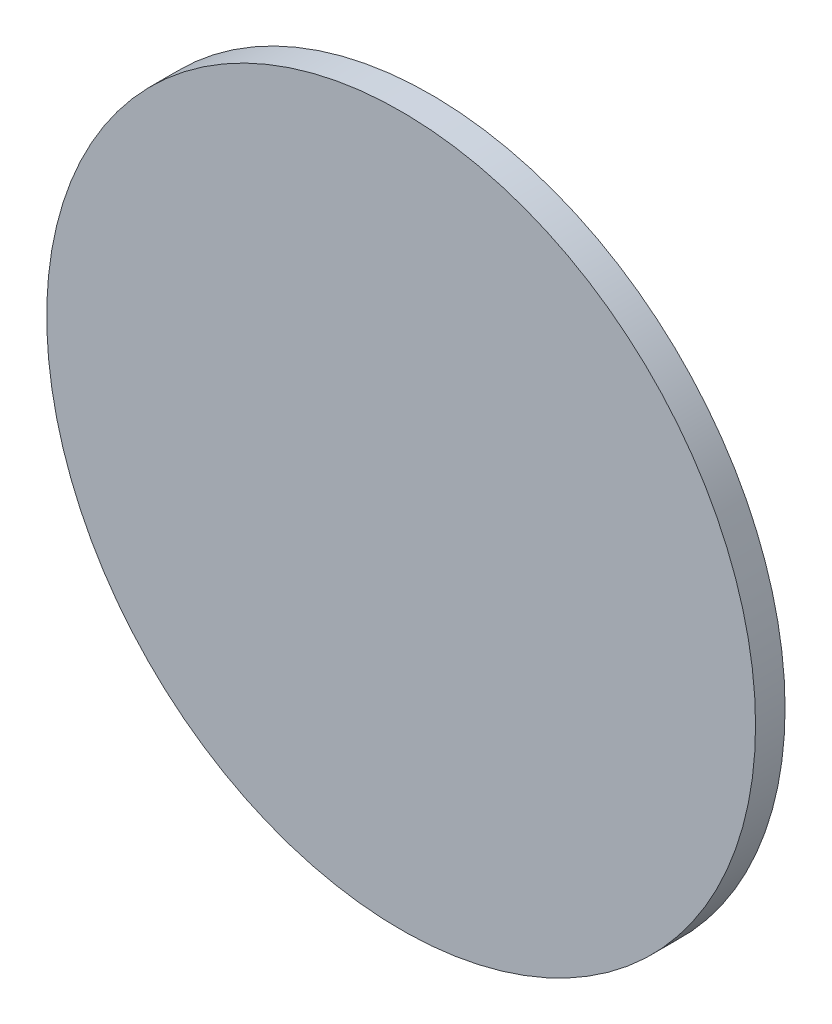
ISO-10303-21;
HEADER;
FILE_DESCRIPTION(('STEP AP214'),'2;1');
FILE_NAME('part.step','',(''),(''),'','','');
FILE_SCHEMA(('AUTOMOTIVE_DESIGN { 1 0 10303 214 1 1 1 1 }'));
ENDSEC;
DATA;
#1=APPLICATION_CONTEXT('core data for automotive mechanical design processes');
#2=APPLICATION_PROTOCOL_DEFINITION('international standard','automotive_design',2000,#1);
#3=PRODUCT_CONTEXT('',#1,'mechanical');
#4=PRODUCT('Part','Part','',(#3));
#5=PRODUCT_RELATED_PRODUCT_CATEGORY('part','',(#4));
#6=PRODUCT_DEFINITION_FORMATION('','',#4);
#7=PRODUCT_DEFINITION_CONTEXT('part definition',#1,'design');
#8=PRODUCT_DEFINITION('design','',#6,#7);
#9=PRODUCT_DEFINITION_SHAPE('','',#8);
#10=(LENGTH_UNIT() NAMED_UNIT(*) SI_UNIT(.MILLI.,.METRE.));
#11=(NAMED_UNIT(*) PLANE_ANGLE_UNIT() SI_UNIT($,.RADIAN.));
#12=(NAMED_UNIT(*) SI_UNIT($,.STERADIAN.) SOLID_ANGLE_UNIT());
#13=UNCERTAINTY_MEASURE_WITH_UNIT(LENGTH_MEASURE(1.E-05),#10,'distance_accuracy_value','');
#14=(GEOMETRIC_REPRESENTATION_CONTEXT(3) GLOBAL_UNCERTAINTY_ASSIGNED_CONTEXT((#13)) GLOBAL_UNIT_ASSIGNED_CONTEXT((#10,
#11,#12)) REPRESENTATION_CONTEXT('',''));
#15=CARTESIAN_POINT('',(0.,0.,0.));
#16=DIRECTION('',(0.,0.,1.));
#17=DIRECTION('',(1.,0.,0.));
#18=AXIS2_PLACEMENT_3D('',#15,#16,#17);
#19=CARTESIAN_POINT('',(0.,0.,1.5));
#20=DIRECTION('',(0.,0.,-1.));
#21=DIRECTION('',(-1.,0.,0.));
#22=AXIS2_PLACEMENT_3D('',#19,#20,#21);
#23=CYLINDRICAL_SURFACE('',#22,18.);
#24=CARTESIAN_POINT('',(0.,0.,1.5));
#25=DIRECTION('',(0.,0.,1.));
#26=DIRECTION('',(1.,0.,0.));
#27=AXIS2_PLACEMENT_3D('',#24,#25,#26);
#28=CIRCLE('',#27,18.);
#29=CARTESIAN_POINT('',(18.,0.,1.5));
#30=VERTEX_POINT('',#29);
#31=EDGE_CURVE('E11',#30,#30,#28,.T.);
#32=ORIENTED_EDGE('',*,*,#31,.F.);
#33=EDGE_LOOP('',(#32));
#34=FACE_BOUND('',#33,.T.);
#35=CARTESIAN_POINT('',(0.,0.,0.));
#36=DIRECTION('',(0.,0.,1.));
#37=DIRECTION('',(1.,0.,0.));
#38=AXIS2_PLACEMENT_3D('',#35,#36,#37);
#39=CIRCLE('',#38,18.);
#40=CARTESIAN_POINT('',(18.,0.,0.));
#41=VERTEX_POINT('',#40);
#42=EDGE_CURVE('E50',#41,#41,#39,.T.);
#43=ORIENTED_EDGE('',*,*,#42,.T.);
#44=EDGE_LOOP('',(#43));
#45=FACE_BOUND('',#44,.T.);
#46=ADVANCED_FACE('F41',(#34,#45),#23,.T.);
#47=CARTESIAN_POINT('',(0.,0.,1.5));
#48=DIRECTION('',(0.,0.,1.));
#49=DIRECTION('',(1.,0.,0.));
#50=AXIS2_PLACEMENT_3D('',#47,#48,#49);
#51=PLANE('',#50);
#52=ORIENTED_EDGE('',*,*,#31,.T.);
#53=EDGE_LOOP('',(#52));
#54=FACE_BOUND('',#53,.T.);
#55=ADVANCED_FACE('F107',(#54),#51,.T.);
#56=CARTESIAN_POINT('',(0.,0.,0.));
#57=DIRECTION('',(0.,0.,1.));
#58=DIRECTION('',(1.,0.,0.));
#59=AXIS2_PLACEMENT_3D('',#56,#57,#58);
#60=PLANE('',#59);
#61=CARTESIAN_POINT('',(0.,0.,0.));
#62=DIRECTION('',(0.,0.,1.));
#63=DIRECTION('',(1.,0.,0.));
#64=AXIS2_PLACEMENT_3D('',#61,#62,#63);
#65=CIRCLE('',#64,7.5);
#66=CARTESIAN_POINT('',(7.32549154250701,-1.60846935334754,0.));
#67=VERTEX_POINT('',#66);
#68=EDGE_CURVE('E64',#67,#67,#65,.T.);
#69=ORIENTED_EDGE('',*,*,#68,.T.);
#70=EDGE_LOOP('',(#69));
#71=FACE_BOUND('',#70,.T.);
#72=ORIENTED_EDGE('',*,*,#42,.F.);
#73=EDGE_LOOP('',(#72));
#74=FACE_BOUND('',#73,.T.);
#75=ADVANCED_FACE('F65',(#71,#74),#60,.F.);
#76=CARTESIAN_POINT('',(0.,0.,-10.));
#77=DIRECTION('',(0.,0.,-1.));
#78=DIRECTION('',(-1.,0.,0.));
#79=AXIS2_PLACEMENT_3D('',#76,#77,#78);
#80=PLANE('',#79);
#81=CARTESIAN_POINT('',(0.,0.,-10.));
#82=DIRECTION('',(0.,0.,-1.));
#83=DIRECTION('',(-1.,0.,0.));
#84=AXIS2_PLACEMENT_3D('',#81,#82,#83);
#85=CIRCLE('',#84,2.75);
#86=CARTESIAN_POINT('',(-2.75,0.,-10.));
#87=VERTEX_POINT('',#86);
#88=EDGE_CURVE('E76',#87,#87,#85,.T.);
#89=ORIENTED_EDGE('',*,*,#88,.F.);
#90=EDGE_LOOP('',(#89));
#91=FACE_BOUND('',#90,.T.);
#92=CARTESIAN_POINT('',(0.,0.,-10.));
#93=DIRECTION('',(0.,0.,-1.));
#94=DIRECTION('',(-1.,0.,0.));
#95=AXIS2_PLACEMENT_3D('',#92,#93,#94);
#96=CIRCLE('',#95,3.25);
#97=CARTESIAN_POINT('',(2.60509270083035,-1.94319119493693,-10.));
#98=VERTEX_POINT('',#97);
#99=EDGE_CURVE('E56',#98,#98,#96,.T.);
#100=ORIENTED_EDGE('',*,*,#99,.T.);
#101=EDGE_LOOP('',(#100));
#102=FACE_BOUND('',#101,.T.);
#103=ADVANCED_FACE('F92',(#91,#102),#80,.T.);
#104=CARTESIAN_POINT('',(7.32549154250701,-1.60846935334754,0.));
#105=CARTESIAN_POINT('',(2.60509270083035,-1.94319119493693,-10.));
#106=CARTESIAN_POINT('',(4.10855283581194,-16.2594524383616,0.));
#107=CARTESIAN_POINT('',(-1.28128968904352,-7.15337659659764,-10.));
#108=CARTESIAN_POINT('',(-10.5424302492021,-13.0425137316665,0.));
#109=CARTESIAN_POINT('',(-6.49147509070422,-3.26699420672377,-10.));
#110=CARTESIAN_POINT('',(-7.32549154250701,1.60846935334754,0.));
#111=CARTESIAN_POINT('',(-2.60509270083035,1.94319119493693,-10.));
#112=CARTESIAN_POINT('',(-4.10855283581194,16.2594524383616,0.));
#113=CARTESIAN_POINT('',(1.28128968904352,7.15337659659764,-10.));
#114=CARTESIAN_POINT('',(10.5424302492021,13.0425137316665,0.));
#115=CARTESIAN_POINT('',(6.49147509070422,3.26699420672377,-10.));
#116=CARTESIAN_POINT('',(7.32549154250701,-1.60846935334754,0.));
#117=CARTESIAN_POINT('',(2.60509270083035,-1.94319119493693,-10.));
#118=(BOUNDED_SURFACE() B_SPLINE_SURFACE(3,1,((#104,#105),(#106,#107),(#108,#109),(#110,#111),
(#112,#113),(#114,#115),(#116,#117)),.UNSPECIFIED.,.T.,.F.,.F.) B_SPLINE_SURFACE_WITH_KNOTS((4,
3,4),(2,2),(0.,0.5,1.),(0.,1.),
.UNSPECIFIED.) GEOMETRIC_REPRESENTATION_ITEM() RATIONAL_B_SPLINE_SURFACE(((1.,1.),
(0.333333333333333,0.333333333333333),(0.333333333333333,0.333333333333333),(1.,1.),
(0.333333333333333,0.333333333333333),(0.333333333333333,0.333333333333333),(1.,1.))) REPRESENTATION_ITEM('') SURFACE());
#119=CARTESIAN_POINT('',(7.32549154250701,-1.60846935334754,0.));
#120=CARTESIAN_POINT('',(7.27632072123955,-1.61195603919743,-0.104166666666667));
#121=CARTESIAN_POINT('',(7.22714989997208,-1.61544272504732,-0.208333333333333));
#122=CARTESIAN_POINT('',(7.12880825743715,-1.6224160967471,-0.416666666666667));
#123=CARTESIAN_POINT('',(7.07963743616969,-1.62590278259699,-0.520833333333333));
#124=CARTESIAN_POINT('',(6.98129579363476,-1.63287615429676,-0.729166666666667));
#125=CARTESIAN_POINT('',(6.93212497236729,-1.63636284014665,-0.833333333333333));
#126=CARTESIAN_POINT('',(6.83378332983236,-1.64333621184643,-1.04166666666667));
#127=CARTESIAN_POINT('',(6.78461250856489,-1.64682289769632,-1.14583333333333));
#128=CARTESIAN_POINT('',(6.68627086602996,-1.6537962693961,-1.35416666666667));
#129=CARTESIAN_POINT('',(6.6371000447625,-1.65728295524599,-1.45833333333333));
#130=CARTESIAN_POINT('',(6.53875840222757,-1.66425632694577,-1.66666666666667));
#131=CARTESIAN_POINT('',(6.4895875809601,-1.66774301279566,-1.77083333333333));
#132=CARTESIAN_POINT('',(6.39124593842517,-1.67471638449544,-1.97916666666667));
#133=CARTESIAN_POINT('',(6.34207511715771,-1.67820307034533,-2.08333333333333));
#134=CARTESIAN_POINT('',(6.24373347462278,-1.68517644204511,-2.29166666666667));
#135=CARTESIAN_POINT('',(6.19456265335531,-1.688663127895,-2.39583333333333));
#136=CARTESIAN_POINT('',(6.09622101082038,-1.69563649959478,-2.60416666666667));
#137=CARTESIAN_POINT('',(6.04705018955292,-1.69912318544467,-2.70833333333333));
#138=CARTESIAN_POINT('',(5.94870854701799,-1.70609655714444,-2.91666666666667));
#139=CARTESIAN_POINT('',(5.89953772575052,-1.70958324299433,-3.02083333333333));
#140=CARTESIAN_POINT('',(5.80119608321559,-1.71655661469411,-3.22916666666667));
#141=CARTESIAN_POINT('',(5.75202526194812,-1.720043300544,-3.33333333333333));
#142=CARTESIAN_POINT('',(5.65368361941319,-1.72701667224378,-3.54166666666667));
#143=CARTESIAN_POINT('',(5.60451279814573,-1.73050335809367,-3.64583333333333));
#144=CARTESIAN_POINT('',(5.5061711556108,-1.73747672979345,-3.85416666666667));
#145=CARTESIAN_POINT('',(5.45700033434333,-1.74096341564334,-3.95833333333333));
#146=CARTESIAN_POINT('',(5.3586586918084,-1.74793678734312,-4.16666666666667));
#147=CARTESIAN_POINT('',(5.30948787054094,-1.75142347319301,-4.27083333333333));
#148=CARTESIAN_POINT('',(5.21114622800601,-1.75839684489279,-4.47916666666667));
#149=CARTESIAN_POINT('',(5.16197540673854,-1.76188353074268,-4.58333333333333));
#150=CARTESIAN_POINT('',(5.06363376420361,-1.76885690244246,-4.79166666666667));
#151=CARTESIAN_POINT('',(5.01446294293615,-1.77234358829235,-4.89583333333333));
#152=CARTESIAN_POINT('',(4.91612130040122,-1.77931695999213,-5.10416666666667));
#153=CARTESIAN_POINT('',(4.86695047913375,-1.78280364584201,-5.20833333333333));
#154=CARTESIAN_POINT('',(4.76860883659882,-1.78977701754179,-5.41666666666667));
#155=CARTESIAN_POINT('',(4.71943801533135,-1.79326370339168,-5.52083333333333));
#156=CARTESIAN_POINT('',(4.62109637279642,-1.80023707509146,-5.72916666666667));
#157=CARTESIAN_POINT('',(4.57192555152896,-1.80372376094135,-5.83333333333333));
#158=CARTESIAN_POINT('',(4.47358390899403,-1.81069713264113,-6.04166666666667));
#159=CARTESIAN_POINT('',(4.42441308772656,-1.81418381849102,-6.14583333333333));
#160=CARTESIAN_POINT('',(4.32607144519163,-1.8211571901908,-6.35416666666667));
#161=CARTESIAN_POINT('',(4.27690062392417,-1.82464387604069,-6.45833333333333));
#162=CARTESIAN_POINT('',(4.17855898138924,-1.83161724774047,-6.66666666666667));
#163=CARTESIAN_POINT('',(4.12938816012177,-1.83510393359036,-6.77083333333333));
#164=CARTESIAN_POINT('',(4.03104651758684,-1.84207730529014,-6.97916666666667));
#165=CARTESIAN_POINT('',(3.98187569631938,-1.84556399114003,-7.08333333333333));
#166=CARTESIAN_POINT('',(3.88353405378445,-1.85253736283981,-7.29166666666667));
#167=CARTESIAN_POINT('',(3.83436323251698,-1.8560240486897,-7.39583333333333));
#168=CARTESIAN_POINT('',(3.73602158998205,-1.86299742038947,-7.60416666666667));
#169=CARTESIAN_POINT('',(3.68685076871459,-1.86648410623936,-7.70833333333333));
#170=CARTESIAN_POINT('',(3.58850912617965,-1.87345747793914,-7.91666666666667));
#171=CARTESIAN_POINT('',(3.53933830491219,-1.87694416378903,-8.02083333333333));
#172=CARTESIAN_POINT('',(3.44099666237726,-1.88391753548881,-8.22916666666667));
#173=CARTESIAN_POINT('',(3.39182584110979,-1.8874042213387,-8.33333333333333));
#174=CARTESIAN_POINT('',(3.29348419857486,-1.89437759303848,-8.54166666666667));
#175=CARTESIAN_POINT('',(3.2443133773074,-1.89786427888837,-8.64583333333333));
#176=CARTESIAN_POINT('',(3.14597173477247,-1.90483765058815,-8.85416666666667));
#177=CARTESIAN_POINT('',(3.096800913505,-1.90832433643804,-8.95833333333333));
#178=CARTESIAN_POINT('',(2.99845927097007,-1.91529770813782,-9.16666666666667));
#179=CARTESIAN_POINT('',(2.94928844970261,-1.91878439398771,-9.27083333333333));
#180=CARTESIAN_POINT('',(2.85094680716768,-1.92575776568749,-9.47916666666667));
#181=CARTESIAN_POINT('',(2.80177598590021,-1.92924445153738,-9.58333333333333));
#182=CARTESIAN_POINT('',(2.70343434336528,-1.93621782323716,-9.79166666666667));
#183=CARTESIAN_POINT('',(2.65426352209782,-1.93970450908704,-9.89583333333333));
#184=CARTESIAN_POINT('',(2.60509270083035,-1.94319119493693,-10.));
#185=B_SPLINE_CURVE_WITH_KNOTS('',3,(#119,#120,#121,#122,#123,#124,#125,#126,#127,#128,#129,
#130,#131,#132,#133,#134,#135,#136,#137,#138,#139,#140,#141,#142,#143,#144,#145,#146,#147,#148,
#149,#150,#151,#152,#153,#154,#155,#156,#157,#158,#159,#160,#161,#162,#163,#164,#165,#166,#167,
#168,#169,#170,#171,#172,#173,#174,#175,#176,#177,#178,#179,#180,#181,#182,#183,#184),
.UNSPECIFIED.,.F.,.F.,(4,2,2,2,2,2,2,2,2,2,2,2,2,2,2,2,2,2,2,2,2,2,2,2,2,2,2,2,2,2,2,2,4),(0.,
0.345724731225574,0.691449462451148,1.03717419367672,1.3828989249023,1.72862365612787,
2.07434838735344,2.42007311857902,2.76579784980459,3.11152258103017,3.45724731225574,
3.80297204348132,4.14869677470689,4.49442150593246,4.84014623715804,5.18587096838361,
5.53159569960919,5.87732043083476,6.22304516206033,6.56876989328591,6.91449462451148,
7.26021935573706,7.60594408696263,7.9516688181882,8.29739354941378,8.64311828063935,
8.98884301186493,9.3345677430905,9.68029247431608,10.0260172055416,10.3717419367672,
10.7174666679928,11.0631913992184),.UNSPECIFIED.);
#186=EDGE_CURVE('BSEAM101',#67,#98,#185,.T.);
#187=ORIENTED_EDGE('',*,*,#68,.F.);
#188=ORIENTED_EDGE('',*,*,#99,.F.);
#189=ORIENTED_EDGE('',*,*,#186,.T.);
#190=ORIENTED_EDGE('',*,*,#186,.F.);
#191=EDGE_LOOP('',(#187,#189,#188,#190));
#192=FACE_BOUND('',#191,.T.);
#193=ADVANCED_FACE('F101',(#192),#118,.T.);
#194=CARTESIAN_POINT('',(0.,0.,0.));
#195=DIRECTION('',(0.,0.,-1.));
#196=DIRECTION('',(-1.,0.,0.));
#197=AXIS2_PLACEMENT_3D('',#194,#195,#196);
#198=CYLINDRICAL_SURFACE('',#197,2.75);
#199=CARTESIAN_POINT('',(0.,0.,0.));
#200=DIRECTION('',(0.,0.,-1.));
#201=DIRECTION('',(-1.,0.,0.));
#202=AXIS2_PLACEMENT_3D('',#199,#200,#201);
#203=CIRCLE('',#202,2.75);
#204=CARTESIAN_POINT('',(-2.75,0.,0.));
#205=VERTEX_POINT('',#204);
#206=EDGE_CURVE('E70',#205,#205,#203,.T.);
#207=ORIENTED_EDGE('',*,*,#206,.F.);
#208=EDGE_LOOP('',(#207));
#209=FACE_BOUND('',#208,.T.);
#210=ORIENTED_EDGE('',*,*,#88,.T.);
#211=EDGE_LOOP('',(#210));
#212=FACE_BOUND('',#211,.T.);
#213=ADVANCED_FACE('F137',(#209,#212),#198,.F.);
#214=CARTESIAN_POINT('',(0.,0.,0.));
#215=DIRECTION('',(0.,0.,-1.));
#216=DIRECTION('',(-1.,0.,0.));
#217=AXIS2_PLACEMENT_3D('',#214,#215,#216);
#218=PLANE('',#217);
#219=ORIENTED_EDGE('',*,*,#206,.T.);
#220=EDGE_LOOP('',(#219));
#221=FACE_BOUND('',#220,.T.);
#222=ADVANCED_FACE('F150',(#221),#218,.T.);
#223=CLOSED_SHELL('',(#46,#55,#75,#103,#193,#213,#222));
#224=MANIFOLD_SOLID_BREP('B2',#223);
#225=ADVANCED_BREP_SHAPE_REPRESENTATION('',(#18,#224),#14);
#226=SHAPE_DEFINITION_REPRESENTATION(#9,#225);
ENDSEC;
END-ISO-10303-21;
